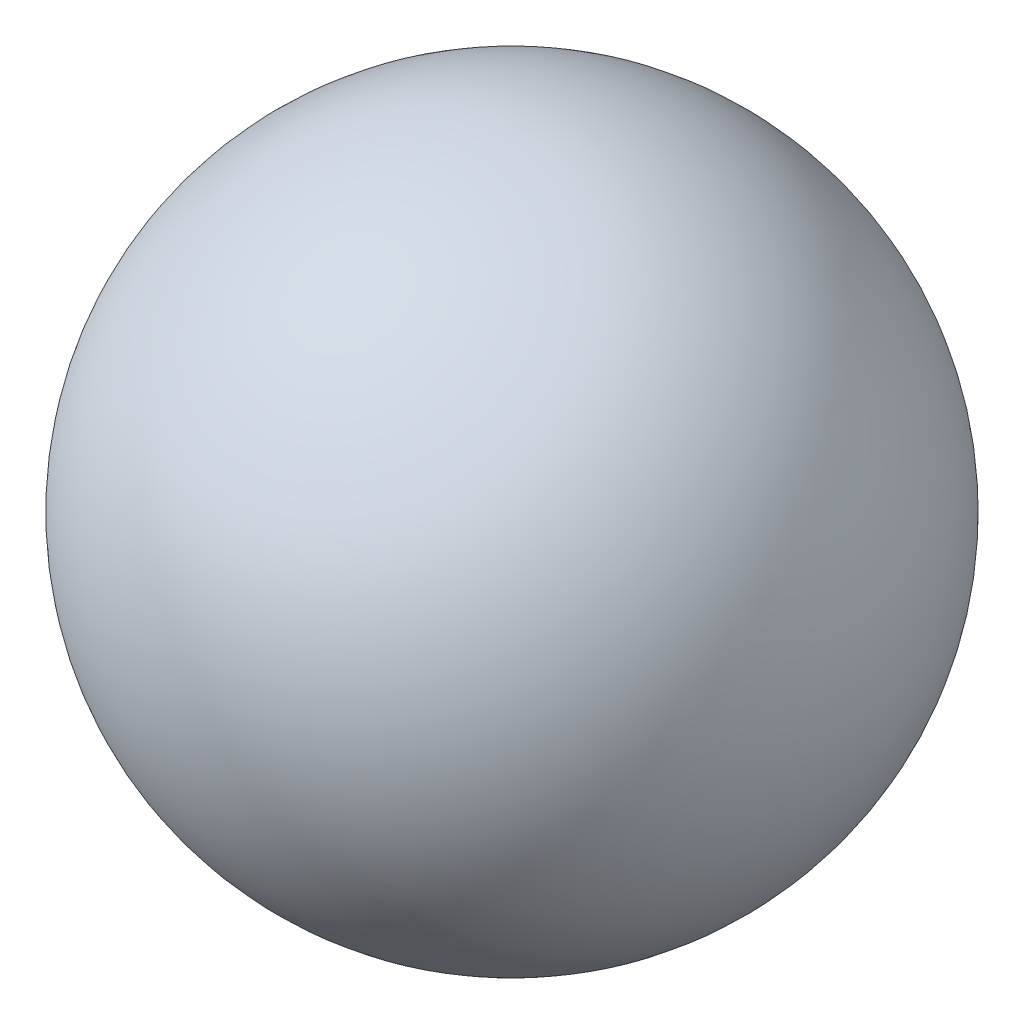
ISO-10303-21;
HEADER;
FILE_DESCRIPTION(('STEP AP214'),'2;1');
FILE_NAME('part.step','',(''),(''),'','','');
FILE_SCHEMA(('AUTOMOTIVE_DESIGN { 1 0 10303 214 1 1 1 1 }'));
ENDSEC;
DATA;
#1=APPLICATION_CONTEXT('core data for automotive mechanical design processes');
#2=APPLICATION_PROTOCOL_DEFINITION('international standard','automotive_design',2000,#1);
#3=PRODUCT_CONTEXT('',#1,'mechanical');
#4=PRODUCT('Part','Part','',(#3));
#5=PRODUCT_RELATED_PRODUCT_CATEGORY('part','',(#4));
#6=PRODUCT_DEFINITION_FORMATION('','',#4);
#7=PRODUCT_DEFINITION_CONTEXT('part definition',#1,'design');
#8=PRODUCT_DEFINITION('design','',#6,#7);
#9=PRODUCT_DEFINITION_SHAPE('','',#8);
#10=(LENGTH_UNIT() NAMED_UNIT(*) SI_UNIT(.MILLI.,.METRE.));
#11=(NAMED_UNIT(*) PLANE_ANGLE_UNIT() SI_UNIT($,.RADIAN.));
#12=(NAMED_UNIT(*) SI_UNIT($,.STERADIAN.) SOLID_ANGLE_UNIT());
#13=UNCERTAINTY_MEASURE_WITH_UNIT(LENGTH_MEASURE(1.E-05),#10,'distance_accuracy_value','');
#14=(GEOMETRIC_REPRESENTATION_CONTEXT(3) GLOBAL_UNCERTAINTY_ASSIGNED_CONTEXT((#13)) GLOBAL_UNIT_ASSIGNED_CONTEXT((#10,
#11,#12)) REPRESENTATION_CONTEXT('',''));
#15=CARTESIAN_POINT('',(0.,0.,0.));
#16=DIRECTION('',(0.,0.,1.));
#17=DIRECTION('',(1.,0.,0.));
#18=AXIS2_PLACEMENT_3D('',#15,#16,#17);
#19=CARTESIAN_POINT('',(0.,12.7,0.));
#20=DIRECTION('',(0.,-1.,0.));
#21=DIRECTION('',(-1.,0.,0.));
#22=AXIS2_PLACEMENT_3D('',#19,#20,#21);
#23=SPHERICAL_SURFACE('',#22,12.7);
#24=CARTESIAN_POINT('',(0.,0.,0.));
#25=VERTEX_POINT('',#24);
#26=VERTEX_LOOP('',#25);
#27=FACE_BOUND('',#26,.T.);
#28=ADVANCED_FACE('F30',(#27),#23,.T.);
#29=CLOSED_SHELL('',(#28));
#30=CARTESIAN_POINT('',(0.,12.7,0.));
#31=DIRECTION('',(0.,-1.,0.));
#32=DIRECTION('',(-1.,0.,0.));
#33=AXIS2_PLACEMENT_3D('',#30,#31,#32);
#34=SPHERICAL_SURFACE('',#33,9.30969047394277);
#35=CARTESIAN_POINT('',(0.,3.39030952605723,0.));
#36=VERTEX_POINT('',#35);
#37=VERTEX_LOOP('',#36);
#38=FACE_BOUND('',#37,.T.);
#39=ADVANCED_FACE('F43',(#38),#34,.F.);
#40=CLOSED_SHELL('',(#39));
#41=ORIENTED_CLOSED_SHELL('',*,#40,.T.);
#42=BREP_WITH_VOIDS('B2',#29,(#41));
#43=ADVANCED_BREP_SHAPE_REPRESENTATION('',(#18,#42),#14);
#44=SHAPE_DEFINITION_REPRESENTATION(#9,#43);
ENDSEC;
END-ISO-10303-21;
